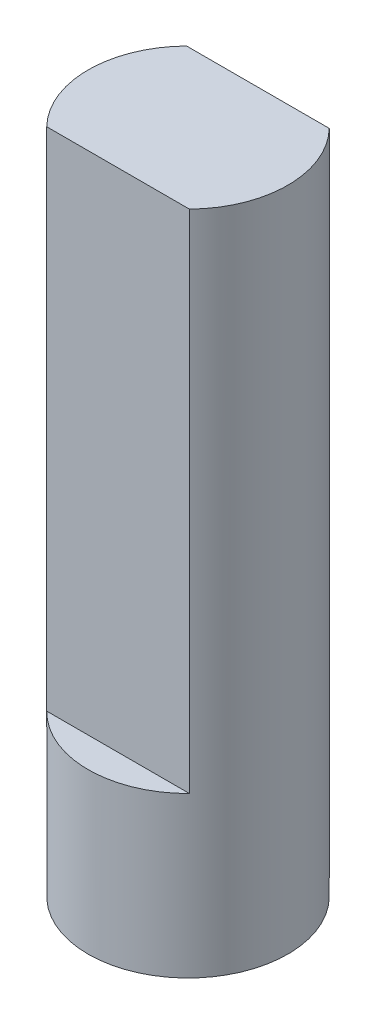
ISO-10303-21;
HEADER;
FILE_DESCRIPTION(('STEP AP214'),'2;1');
FILE_NAME('part.step','',(''),(''),'','','');
FILE_SCHEMA(('AUTOMOTIVE_DESIGN { 1 0 10303 214 1 1 1 1 }'));
ENDSEC;
DATA;
#1=APPLICATION_CONTEXT('core data for automotive mechanical design processes');
#2=APPLICATION_PROTOCOL_DEFINITION('international standard','automotive_design',2000,#1);
#3=PRODUCT_CONTEXT('',#1,'mechanical');
#4=PRODUCT('Part','Part','',(#3));
#5=PRODUCT_RELATED_PRODUCT_CATEGORY('part','',(#4));
#6=PRODUCT_DEFINITION_FORMATION('','',#4);
#7=PRODUCT_DEFINITION_CONTEXT('part definition',#1,'design');
#8=PRODUCT_DEFINITION('design','',#6,#7);
#9=PRODUCT_DEFINITION_SHAPE('','',#8);
#10=(LENGTH_UNIT() NAMED_UNIT(*) SI_UNIT(.MILLI.,.METRE.));
#11=(NAMED_UNIT(*) PLANE_ANGLE_UNIT() SI_UNIT($,.RADIAN.));
#12=(NAMED_UNIT(*) SI_UNIT($,.STERADIAN.) SOLID_ANGLE_UNIT());
#13=UNCERTAINTY_MEASURE_WITH_UNIT(LENGTH_MEASURE(1.E-05),#10,'distance_accuracy_value','');
#14=(GEOMETRIC_REPRESENTATION_CONTEXT(3) GLOBAL_UNCERTAINTY_ASSIGNED_CONTEXT((#13)) GLOBAL_UNIT_ASSIGNED_CONTEXT((#10,
#11,#12)) REPRESENTATION_CONTEXT('',''));
#15=CARTESIAN_POINT('',(0.,0.,0.));
#16=DIRECTION('',(0.,0.,1.));
#17=DIRECTION('',(1.,0.,0.));
#18=AXIS2_PLACEMENT_3D('',#15,#16,#17);
#19=CARTESIAN_POINT('',(0.,20.,0.));
#20=DIRECTION('',(0.,-1.,0.));
#21=DIRECTION('',(0.,0.,-1.));
#22=AXIS2_PLACEMENT_3D('',#19,#20,#21);
#23=CYLINDRICAL_SURFACE('',#22,3.);
#24=CARTESIAN_POINT('',(0.,20.,0.));
#25=DIRECTION('',(0.,1.,0.));
#26=DIRECTION('',(0.,0.,1.));
#27=AXIS2_PLACEMENT_3D('',#24,#25,#26);
#28=CIRCLE('',#27,3.);
#29=CARTESIAN_POINT('',(2.14242852856285,20.,2.1));
#30=VERTEX_POINT('',#29);
#31=CARTESIAN_POINT('',(2.14242852856285,20.,-2.1));
#32=VERTEX_POINT('',#31);
#33=EDGE_CURVE('E42',#30,#32,#28,.T.);
#34=ORIENTED_EDGE('',*,*,#33,.F.);
#35=DIRECTION('',(0.,1.,0.));
#36=VECTOR('',#35,1.);
#37=CARTESIAN_POINT('',(2.14242852856285,4.8,2.1));
#38=LINE('',#37,#36);
#39=CARTESIAN_POINT('',(2.14242852856285,4.8,2.1));
#40=VERTEX_POINT('',#39);
#41=EDGE_CURVE('E49',#40,#30,#38,.T.);
#42=ORIENTED_EDGE('',*,*,#41,.F.);
#43=CARTESIAN_POINT('',(0.,4.8,0.));
#44=DIRECTION('',(0.,1.,0.));
#45=DIRECTION('',(0.,0.,1.));
#46=AXIS2_PLACEMENT_3D('',#43,#44,#45);
#47=CIRCLE('',#46,3.);
#48=CARTESIAN_POINT('',(-2.14242852856285,4.8,2.1));
#49=VERTEX_POINT('',#48);
#50=EDGE_CURVE('E78',#49,#40,#47,.T.);
#51=ORIENTED_EDGE('',*,*,#50,.F.);
#52=DIRECTION('',(0.,1.,0.));
#53=VECTOR('',#52,1.);
#54=CARTESIAN_POINT('',(-2.14242852856285,4.8,2.1));
#55=LINE('',#54,#53);
#56=CARTESIAN_POINT('',(-2.14242852856285,20.,2.1));
#57=VERTEX_POINT('',#56);
#58=EDGE_CURVE('E86',#49,#57,#55,.T.);
#59=ORIENTED_EDGE('',*,*,#58,.T.);
#60=CARTESIAN_POINT('',(-2.14242852856285,20.,-2.1));
#61=VERTEX_POINT('',#60);
#62=EDGE_CURVE('E11',#61,#57,#28,.T.);
#63=ORIENTED_EDGE('',*,*,#62,.F.);
#64=DIRECTION('',(0.,1.,0.));
#65=VECTOR('',#64,1.);
#66=CARTESIAN_POINT('',(-2.14242852856285,4.8,-2.1));
#67=LINE('',#66,#65);
#68=CARTESIAN_POINT('',(-2.14242852856285,4.8,-2.1));
#69=VERTEX_POINT('',#68);
#70=EDGE_CURVE('E57',#69,#61,#67,.T.);
#71=ORIENTED_EDGE('',*,*,#70,.F.);
#72=CARTESIAN_POINT('',(0.,4.8,0.));
#73=DIRECTION('',(0.,1.,0.));
#74=DIRECTION('',(0.,0.,1.));
#75=AXIS2_PLACEMENT_3D('',#72,#73,#74);
#76=CIRCLE('',#75,3.);
#77=CARTESIAN_POINT('',(2.14242852856285,4.8,-2.1));
#78=VERTEX_POINT('',#77);
#79=EDGE_CURVE('E96',#78,#69,#76,.T.);
#80=ORIENTED_EDGE('',*,*,#79,.F.);
#81=DIRECTION('',(0.,1.,0.));
#82=VECTOR('',#81,1.);
#83=CARTESIAN_POINT('',(2.14242852856285,4.8,-2.1));
#84=LINE('',#83,#82);
#85=EDGE_CURVE('E102',#78,#32,#84,.T.);
#86=ORIENTED_EDGE('',*,*,#85,.T.);
#87=EDGE_LOOP('',(#34,#42,#51,#59,#63,#71,#80,#86));
#88=FACE_BOUND('',#87,.T.);
#89=CARTESIAN_POINT('',(0.,0.,0.));
#90=DIRECTION('',(0.,1.,0.));
#91=DIRECTION('',(0.,0.,1.));
#92=AXIS2_PLACEMENT_3D('',#89,#90,#91);
#93=CIRCLE('',#92,3.);
#94=CARTESIAN_POINT('',(0.,0.,3.));
#95=VERTEX_POINT('',#94);
#96=EDGE_CURVE('E37',#95,#95,#93,.T.);
#97=ORIENTED_EDGE('',*,*,#96,.T.);
#98=EDGE_LOOP('',(#97));
#99=FACE_BOUND('',#98,.T.);
#100=ADVANCED_FACE('F34',(#88,#99),#23,.T.);
#101=CARTESIAN_POINT('',(0.,20.,0.));
#102=DIRECTION('',(0.,1.,0.));
#103=DIRECTION('',(0.,0.,1.));
#104=AXIS2_PLACEMENT_3D('',#101,#102,#103);
#105=PLANE('',#104);
#106=DIRECTION('',(-1.,0.,0.));
#107=VECTOR('',#106,1.);
#108=CARTESIAN_POINT('',(-2.14242852856285,20.,2.1));
#109=LINE('',#108,#107);
#110=EDGE_CURVE('E83',#30,#57,#109,.T.);
#111=ORIENTED_EDGE('',*,*,#110,.F.);
#112=ORIENTED_EDGE('',*,*,#33,.T.);
#113=DIRECTION('',(1.,0.,0.));
#114=VECTOR('',#113,1.);
#115=CARTESIAN_POINT('',(-2.14242852856285,20.,-2.1));
#116=LINE('',#115,#114);
#117=EDGE_CURVE('E92',#61,#32,#116,.T.);
#118=ORIENTED_EDGE('',*,*,#117,.F.);
#119=ORIENTED_EDGE('',*,*,#62,.T.);
#120=EDGE_LOOP('',(#111,#112,#118,#119));
#121=FACE_BOUND('',#120,.T.);
#122=ADVANCED_FACE('F108',(#121),#105,.T.);
#123=CARTESIAN_POINT('',(0.,0.,0.));
#124=DIRECTION('',(0.,1.,0.));
#125=DIRECTION('',(0.,0.,1.));
#126=AXIS2_PLACEMENT_3D('',#123,#124,#125);
#127=PLANE('',#126);
#128=ORIENTED_EDGE('',*,*,#96,.F.);
#129=EDGE_LOOP('',(#128));
#130=FACE_BOUND('',#129,.T.);
#131=ADVANCED_FACE('F120',(#130),#127,.F.);
#132=CARTESIAN_POINT('',(-2.14242852856285,4.8,-2.1));
#133=DIRECTION('',(0.,0.,1.));
#134=DIRECTION('',(1.,0.,0.));
#135=AXIS2_PLACEMENT_3D('',#132,#133,#134);
#136=PLANE('',#135);
#137=ORIENTED_EDGE('',*,*,#117,.T.);
#138=ORIENTED_EDGE('',*,*,#85,.F.);
#139=DIRECTION('',(1.,0.,0.));
#140=VECTOR('',#139,1.);
#141=CARTESIAN_POINT('',(-2.14242852856285,4.8,-2.1));
#142=LINE('',#141,#140);
#143=EDGE_CURVE('E98',#69,#78,#142,.T.);
#144=ORIENTED_EDGE('',*,*,#143,.F.);
#145=ORIENTED_EDGE('',*,*,#70,.T.);
#146=EDGE_LOOP('',(#137,#138,#144,#145));
#147=FACE_BOUND('',#146,.T.);
#148=ADVANCED_FACE('F110',(#147),#136,.F.);
#149=CARTESIAN_POINT('',(0.,4.8,0.));
#150=DIRECTION('',(0.,1.,0.));
#151=DIRECTION('',(0.,0.,1.));
#152=AXIS2_PLACEMENT_3D('',#149,#150,#151);
#153=PLANE('',#152);
#154=ORIENTED_EDGE('',*,*,#79,.T.);
#155=ORIENTED_EDGE('',*,*,#143,.T.);
#156=EDGE_LOOP('',(#154,#155));
#157=FACE_BOUND('',#156,.T.);
#158=ADVANCED_FACE('F112',(#157),#153,.T.);
#159=CARTESIAN_POINT('',(-2.14242852856285,4.8,2.1));
#160=DIRECTION('',(0.,0.,-1.));
#161=DIRECTION('',(-1.,0.,0.));
#162=AXIS2_PLACEMENT_3D('',#159,#160,#161);
#163=PLANE('',#162);
#164=ORIENTED_EDGE('',*,*,#110,.T.);
#165=ORIENTED_EDGE('',*,*,#58,.F.);
#166=DIRECTION('',(-1.,0.,0.));
#167=VECTOR('',#166,1.);
#168=CARTESIAN_POINT('',(-2.14242852856285,4.8,2.1));
#169=LINE('',#168,#167);
#170=EDGE_CURVE('E80',#40,#49,#169,.T.);
#171=ORIENTED_EDGE('',*,*,#170,.F.);
#172=ORIENTED_EDGE('',*,*,#41,.T.);
#173=EDGE_LOOP('',(#164,#165,#171,#172));
#174=FACE_BOUND('',#173,.T.);
#175=ADVANCED_FACE('F85',(#174),#163,.F.);
#176=CARTESIAN_POINT('',(0.,4.8,0.));
#177=DIRECTION('',(0.,1.,0.));
#178=DIRECTION('',(0.,0.,1.));
#179=AXIS2_PLACEMENT_3D('',#176,#177,#178);
#180=PLANE('',#179);
#181=ORIENTED_EDGE('',*,*,#50,.T.);
#182=ORIENTED_EDGE('',*,*,#170,.T.);
#183=EDGE_LOOP('',(#181,#182));
#184=FACE_BOUND('',#183,.T.);
#185=ADVANCED_FACE('F79',(#184),#180,.T.);
#186=CLOSED_SHELL('',(#100,#122,#131,#148,#158,#175,#185));
#187=MANIFOLD_SOLID_BREP('B2',#186);
#188=ADVANCED_BREP_SHAPE_REPRESENTATION('',(#18,#187),#14);
#189=SHAPE_DEFINITION_REPRESENTATION(#9,#188);
ENDSEC;
END-ISO-10303-21;
